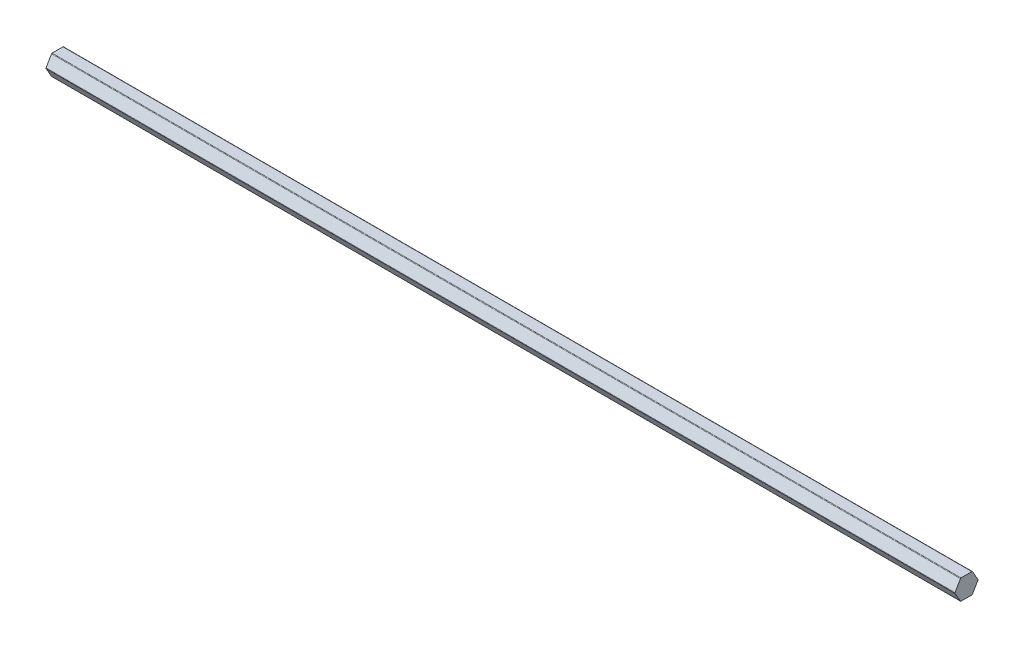
ISO-10303-21;
HEADER;
FILE_DESCRIPTION(('STEP AP214'),'2;1');
FILE_NAME('part.step','',(''),(''),'','','');
FILE_SCHEMA(('AUTOMOTIVE_DESIGN { 1 0 10303 214 1 1 1 1 }'));
ENDSEC;
DATA;
#1=APPLICATION_CONTEXT('core data for automotive mechanical design processes');
#2=APPLICATION_PROTOCOL_DEFINITION('international standard','automotive_design',2000,#1);
#3=PRODUCT_CONTEXT('',#1,'mechanical');
#4=PRODUCT('Part','Part','',(#3));
#5=PRODUCT_RELATED_PRODUCT_CATEGORY('part','',(#4));
#6=PRODUCT_DEFINITION_FORMATION('','',#4);
#7=PRODUCT_DEFINITION_CONTEXT('part definition',#1,'design');
#8=PRODUCT_DEFINITION('design','',#6,#7);
#9=PRODUCT_DEFINITION_SHAPE('','',#8);
#10=(LENGTH_UNIT() NAMED_UNIT(*) SI_UNIT(.MILLI.,.METRE.));
#11=(NAMED_UNIT(*) PLANE_ANGLE_UNIT() SI_UNIT($,.RADIAN.));
#12=(NAMED_UNIT(*) SI_UNIT($,.STERADIAN.) SOLID_ANGLE_UNIT());
#13=UNCERTAINTY_MEASURE_WITH_UNIT(LENGTH_MEASURE(1.E-05),#10,'distance_accuracy_value','');
#14=(GEOMETRIC_REPRESENTATION_CONTEXT(3) GLOBAL_UNCERTAINTY_ASSIGNED_CONTEXT((#13)) GLOBAL_UNIT_ASSIGNED_CONTEXT((#10,
#11,#12)) REPRESENTATION_CONTEXT('',''));
#15=CARTESIAN_POINT('',(0.,0.,0.));
#16=DIRECTION('',(0.,0.,1.));
#17=DIRECTION('',(1.,0.,0.));
#18=AXIS2_PLACEMENT_3D('',#15,#16,#17);
#19=CARTESIAN_POINT('',(285.75,-5.85,3.37749907475931));
#20=DIRECTION('',(-1.,0.,0.));
#21=DIRECTION('',(0.,0.,1.));
#22=AXIS2_PLACEMENT_3D('',#19,#20,#21);
#23=CYLINDRICAL_SURFACE('',#22,0.5);
#24=CARTESIAN_POINT('',(-285.75,-5.85,3.37749907475931));
#25=DIRECTION('',(1.,0.,0.));
#26=DIRECTION('',(0.,0.,-1.));
#27=AXIS2_PLACEMENT_3D('',#24,#25,#26);
#28=CIRCLE('',#27,0.5);
#29=CARTESIAN_POINT('',(-285.75,-6.09999999999999,3.81051177665153));
#30=VERTEX_POINT('',#29);
#31=CARTESIAN_POINT('',(-285.75,-6.35,3.37749907475931));
#32=VERTEX_POINT('',#31);
#33=EDGE_CURVE('E164',#30,#32,#28,.T.);
#34=ORIENTED_EDGE('',*,*,#33,.T.);
#35=DIRECTION('',(-1.,0.,0.));
#36=VECTOR('',#35,1.);
#37=CARTESIAN_POINT('',(285.75,-6.35,3.37749907475931));
#38=LINE('',#37,#36);
#39=CARTESIAN_POINT('',(285.75,-6.35,3.37749907475931));
#40=VERTEX_POINT('',#39);
#41=EDGE_CURVE('E11',#40,#32,#38,.T.);
#42=ORIENTED_EDGE('',*,*,#41,.F.);
#43=CARTESIAN_POINT('',(285.75,-5.85,3.37749907475931));
#44=DIRECTION('',(1.,0.,0.));
#45=DIRECTION('',(0.,0.,-1.));
#46=AXIS2_PLACEMENT_3D('',#43,#44,#45);
#47=CIRCLE('',#46,0.5);
#48=CARTESIAN_POINT('',(285.75,-6.09999999999999,3.81051177665153));
#49=VERTEX_POINT('',#48);
#50=EDGE_CURVE('E198',#49,#40,#47,.T.);
#51=ORIENTED_EDGE('',*,*,#50,.F.);
#52=DIRECTION('',(-1.,0.,0.));
#53=VECTOR('',#52,1.);
#54=CARTESIAN_POINT('',(285.75,-6.09999999999999,3.81051177665153));
#55=LINE('',#54,#53);
#56=EDGE_CURVE('E160',#49,#30,#55,.T.);
#57=ORIENTED_EDGE('',*,*,#56,.T.);
#58=EDGE_LOOP('',(#34,#42,#51,#57));
#59=FACE_BOUND('',#58,.T.);
#60=ADVANCED_FACE('F39',(#59),#23,.T.);
#61=CARTESIAN_POINT('',(285.75,-6.35,3.37749907475931));
#62=DIRECTION('',(0.,1.,0.));
#63=DIRECTION('',(0.,0.,1.));
#64=AXIS2_PLACEMENT_3D('',#61,#62,#63);
#65=PLANE('',#64);
#66=DIRECTION('',(0.,0.,-1.));
#67=VECTOR('',#66,1.);
#68=CARTESIAN_POINT('',(-285.75,-6.35,3.37749907475931));
#69=LINE('',#68,#67);
#70=CARTESIAN_POINT('',(-285.75,-6.35,-3.3774990747593));
#71=VERTEX_POINT('',#70);
#72=EDGE_CURVE('E168',#32,#71,#69,.T.);
#73=ORIENTED_EDGE('',*,*,#72,.T.);
#74=DIRECTION('',(-1.,0.,0.));
#75=VECTOR('',#74,1.);
#76=CARTESIAN_POINT('',(285.75,-6.35,-3.3774990747593));
#77=LINE('',#76,#75);
#78=CARTESIAN_POINT('',(285.75,-6.35,-3.3774990747593));
#79=VERTEX_POINT('',#78);
#80=EDGE_CURVE('E48',#79,#71,#77,.T.);
#81=ORIENTED_EDGE('',*,*,#80,.F.);
#82=DIRECTION('',(0.,0.,-1.));
#83=VECTOR('',#82,1.);
#84=CARTESIAN_POINT('',(285.75,-6.35,3.37749907475931));
#85=LINE('',#84,#83);
#86=EDGE_CURVE('E111',#40,#79,#85,.T.);
#87=ORIENTED_EDGE('',*,*,#86,.F.);
#88=ORIENTED_EDGE('',*,*,#41,.T.);
#89=EDGE_LOOP('',(#73,#81,#87,#88));
#90=FACE_BOUND('',#89,.T.);
#91=ADVANCED_FACE('F292',(#90),#65,.F.);
#92=CARTESIAN_POINT('',(285.75,-5.85,-3.37749907475931));
#93=DIRECTION('',(-1.,0.,0.));
#94=DIRECTION('',(0.,0.,1.));
#95=AXIS2_PLACEMENT_3D('',#92,#93,#94);
#96=CYLINDRICAL_SURFACE('',#95,0.5);
#97=CARTESIAN_POINT('',(-285.75,-5.85,-3.37749907475931));
#98=DIRECTION('',(1.,0.,0.));
#99=DIRECTION('',(0.,0.,-1.));
#100=AXIS2_PLACEMENT_3D('',#97,#98,#99);
#101=CIRCLE('',#100,0.5);
#102=CARTESIAN_POINT('',(-285.75,-6.1,-3.81051177665153));
#103=VERTEX_POINT('',#102);
#104=EDGE_CURVE('E171',#71,#103,#101,.T.);
#105=ORIENTED_EDGE('',*,*,#104,.T.);
#106=DIRECTION('',(-1.,0.,0.));
#107=VECTOR('',#106,1.);
#108=CARTESIAN_POINT('',(285.75,-6.1,-3.81051177665153));
#109=LINE('',#108,#107);
#110=CARTESIAN_POINT('',(285.75,-6.1,-3.81051177665153));
#111=VERTEX_POINT('',#110);
#112=EDGE_CURVE('E225',#111,#103,#109,.T.);
#113=ORIENTED_EDGE('',*,*,#112,.F.);
#114=CARTESIAN_POINT('',(285.75,-5.85,-3.37749907475931));
#115=DIRECTION('',(1.,0.,0.));
#116=DIRECTION('',(0.,0.,-1.));
#117=AXIS2_PLACEMENT_3D('',#114,#115,#116);
#118=CIRCLE('',#117,0.5);
#119=EDGE_CURVE('E235',#79,#111,#118,.T.);
#120=ORIENTED_EDGE('',*,*,#119,.F.);
#121=ORIENTED_EDGE('',*,*,#80,.T.);
#122=EDGE_LOOP('',(#105,#113,#120,#121));
#123=FACE_BOUND('',#122,.T.);
#124=ADVANCED_FACE('F233',(#123),#96,.T.);
#125=CARTESIAN_POINT('',(285.75,-6.1,-3.81051177665153));
#126=DIRECTION('',(0.,0.5,0.866025403784439));
#127=DIRECTION('',(0.,-0.866025403784439,0.5));
#128=AXIS2_PLACEMENT_3D('',#125,#126,#127);
#129=PLANE('',#128);
#130=DIRECTION('',(0.,0.866025403784439,-0.5));
#131=VECTOR('',#130,1.);
#132=CARTESIAN_POINT('',(-285.75,-6.1,-3.81051177665153));
#133=LINE('',#132,#131);
#134=CARTESIAN_POINT('',(-285.75,-0.250000000000002,-7.18801085141083));
#135=VERTEX_POINT('',#134);
#136=EDGE_CURVE('E174',#103,#135,#133,.T.);
#137=ORIENTED_EDGE('',*,*,#136,.T.);
#138=DIRECTION('',(-1.,0.,0.));
#139=VECTOR('',#138,1.);
#140=CARTESIAN_POINT('',(285.75,-0.250000000000002,-7.18801085141083));
#141=LINE('',#140,#139);
#142=CARTESIAN_POINT('',(285.75,-0.250000000000002,-7.18801085141083));
#143=VERTEX_POINT('',#142);
#144=EDGE_CURVE('E221',#143,#135,#141,.T.);
#145=ORIENTED_EDGE('',*,*,#144,.F.);
#146=DIRECTION('',(0.,0.866025403784439,-0.5));
#147=VECTOR('',#146,1.);
#148=CARTESIAN_POINT('',(285.75,-6.1,-3.81051177665153));
#149=LINE('',#148,#147);
#150=EDGE_CURVE('E254',#111,#143,#149,.T.);
#151=ORIENTED_EDGE('',*,*,#150,.F.);
#152=ORIENTED_EDGE('',*,*,#112,.T.);
#153=EDGE_LOOP('',(#137,#145,#151,#152));
#154=FACE_BOUND('',#153,.T.);
#155=ADVANCED_FACE('F244',(#154),#129,.F.);
#156=CARTESIAN_POINT('',(285.75,0.,-6.75499814951862));
#157=DIRECTION('',(-1.,0.,0.));
#158=DIRECTION('',(0.,0.,1.));
#159=AXIS2_PLACEMENT_3D('',#156,#157,#158);
#160=CYLINDRICAL_SURFACE('',#159,0.5);
#161=CARTESIAN_POINT('',(-285.75,0.,-6.75499814951862));
#162=DIRECTION('',(1.,0.,0.));
#163=DIRECTION('',(0.,0.,1.));
#164=AXIS2_PLACEMENT_3D('',#161,#162,#163);
#165=CIRCLE('',#164,0.5);
#166=CARTESIAN_POINT('',(-285.75,0.250000000000002,-7.18801085141083));
#167=VERTEX_POINT('',#166);
#168=EDGE_CURVE('E177',#135,#167,#165,.T.);
#169=ORIENTED_EDGE('',*,*,#168,.T.);
#170=DIRECTION('',(-1.,0.,0.));
#171=VECTOR('',#170,1.);
#172=CARTESIAN_POINT('',(285.75,0.250000000000002,-7.18801085141083));
#173=LINE('',#172,#171);
#174=CARTESIAN_POINT('',(285.75,0.250000000000002,-7.18801085141083));
#175=VERTEX_POINT('',#174);
#176=EDGE_CURVE('E217',#175,#167,#173,.T.);
#177=ORIENTED_EDGE('',*,*,#176,.F.);
#178=CARTESIAN_POINT('',(285.75,0.,-6.75499814951862));
#179=DIRECTION('',(1.,0.,0.));
#180=DIRECTION('',(0.,0.,1.));
#181=AXIS2_PLACEMENT_3D('',#178,#179,#180);
#182=CIRCLE('',#181,0.5);
#183=EDGE_CURVE('E250',#143,#175,#182,.T.);
#184=ORIENTED_EDGE('',*,*,#183,.F.);
#185=ORIENTED_EDGE('',*,*,#144,.T.);
#186=EDGE_LOOP('',(#169,#177,#184,#185));
#187=FACE_BOUND('',#186,.T.);
#188=ADVANCED_FACE('F248',(#187),#160,.T.);
#189=CARTESIAN_POINT('',(285.75,0.250000000000002,-7.18801085141083));
#190=DIRECTION('',(0.,-0.5,0.866025403784439));
#191=DIRECTION('',(0.,-0.866025403784439,-0.5));
#192=AXIS2_PLACEMENT_3D('',#189,#190,#191);
#193=PLANE('',#192);
#194=DIRECTION('',(0.,0.866025403784439,0.5));
#195=VECTOR('',#194,1.);
#196=CARTESIAN_POINT('',(-285.75,0.250000000000002,-7.18801085141083));
#197=LINE('',#196,#195);
#198=CARTESIAN_POINT('',(-285.75,6.1,-3.81051177665153));
#199=VERTEX_POINT('',#198);
#200=EDGE_CURVE('E180',#167,#199,#197,.T.);
#201=ORIENTED_EDGE('',*,*,#200,.T.);
#202=DIRECTION('',(-1.,0.,0.));
#203=VECTOR('',#202,1.);
#204=CARTESIAN_POINT('',(285.75,6.1,-3.81051177665153));
#205=LINE('',#204,#203);
#206=CARTESIAN_POINT('',(285.75,6.1,-3.81051177665153));
#207=VERTEX_POINT('',#206);
#208=EDGE_CURVE('E213',#207,#199,#205,.T.);
#209=ORIENTED_EDGE('',*,*,#208,.F.);
#210=DIRECTION('',(0.,0.866025403784439,0.5));
#211=VECTOR('',#210,1.);
#212=CARTESIAN_POINT('',(285.75,0.250000000000002,-7.18801085141083));
#213=LINE('',#212,#211);
#214=EDGE_CURVE('E253',#175,#207,#213,.T.);
#215=ORIENTED_EDGE('',*,*,#214,.F.);
#216=ORIENTED_EDGE('',*,*,#176,.T.);
#217=EDGE_LOOP('',(#201,#209,#215,#216));
#218=FACE_BOUND('',#217,.T.);
#219=ADVANCED_FACE('F305',(#218),#193,.F.);
#220=CARTESIAN_POINT('',(285.75,5.85,-3.37749907475931));
#221=DIRECTION('',(-1.,0.,0.));
#222=DIRECTION('',(0.,0.,1.));
#223=AXIS2_PLACEMENT_3D('',#220,#221,#222);
#224=CYLINDRICAL_SURFACE('',#223,0.5);
#225=CARTESIAN_POINT('',(-285.75,5.85,-3.37749907475931));
#226=DIRECTION('',(1.,0.,0.));
#227=DIRECTION('',(0.,0.,-1.));
#228=AXIS2_PLACEMENT_3D('',#225,#226,#227);
#229=CIRCLE('',#228,0.5);
#230=CARTESIAN_POINT('',(-285.75,6.35,-3.3774990747593));
#231=VERTEX_POINT('',#230);
#232=EDGE_CURVE('E183',#199,#231,#229,.T.);
#233=ORIENTED_EDGE('',*,*,#232,.T.);
#234=DIRECTION('',(-1.,0.,0.));
#235=VECTOR('',#234,1.);
#236=CARTESIAN_POINT('',(285.75,6.35,-3.3774990747593));
#237=LINE('',#236,#235);
#238=CARTESIAN_POINT('',(285.75,6.35,-3.3774990747593));
#239=VERTEX_POINT('',#238);
#240=EDGE_CURVE('E209',#239,#231,#237,.T.);
#241=ORIENTED_EDGE('',*,*,#240,.F.);
#242=CARTESIAN_POINT('',(285.75,5.85,-3.37749907475931));
#243=DIRECTION('',(1.,0.,0.));
#244=DIRECTION('',(0.,0.,-1.));
#245=AXIS2_PLACEMENT_3D('',#242,#243,#244);
#246=CIRCLE('',#245,0.5);
#247=EDGE_CURVE('E258',#207,#239,#246,.T.);
#248=ORIENTED_EDGE('',*,*,#247,.F.);
#249=ORIENTED_EDGE('',*,*,#208,.T.);
#250=EDGE_LOOP('',(#233,#241,#248,#249));
#251=FACE_BOUND('',#250,.T.);
#252=ADVANCED_FACE('F308',(#251),#224,.T.);
#253=CARTESIAN_POINT('',(285.75,6.35,-3.3774990747593));
#254=DIRECTION('',(0.,-1.,0.));
#255=DIRECTION('',(0.,0.,-1.));
#256=AXIS2_PLACEMENT_3D('',#253,#254,#255);
#257=PLANE('',#256);
#258=DIRECTION('',(0.,0.,1.));
#259=VECTOR('',#258,1.);
#260=CARTESIAN_POINT('',(-285.75,6.35,-3.3774990747593));
#261=LINE('',#260,#259);
#262=CARTESIAN_POINT('',(-285.75,6.35,3.37749907475931));
#263=VERTEX_POINT('',#262);
#264=EDGE_CURVE('E186',#231,#263,#261,.T.);
#265=ORIENTED_EDGE('',*,*,#264,.T.);
#266=DIRECTION('',(-1.,0.,0.));
#267=VECTOR('',#266,1.);
#268=CARTESIAN_POINT('',(285.75,6.35,3.37749907475931));
#269=LINE('',#268,#267);
#270=CARTESIAN_POINT('',(285.75,6.35,3.37749907475931));
#271=VERTEX_POINT('',#270);
#272=EDGE_CURVE('E205',#271,#263,#269,.T.);
#273=ORIENTED_EDGE('',*,*,#272,.F.);
#274=DIRECTION('',(0.,0.,1.));
#275=VECTOR('',#274,1.);
#276=CARTESIAN_POINT('',(285.75,6.35,-3.3774990747593));
#277=LINE('',#276,#275);
#278=EDGE_CURVE('E265',#239,#271,#277,.T.);
#279=ORIENTED_EDGE('',*,*,#278,.F.);
#280=ORIENTED_EDGE('',*,*,#240,.T.);
#281=EDGE_LOOP('',(#265,#273,#279,#280));
#282=FACE_BOUND('',#281,.T.);
#283=ADVANCED_FACE('F273',(#282),#257,.F.);
#284=CARTESIAN_POINT('',(285.75,5.85,3.37749907475931));
#285=DIRECTION('',(-1.,0.,0.));
#286=DIRECTION('',(0.,0.,1.));
#287=AXIS2_PLACEMENT_3D('',#284,#285,#286);
#288=CYLINDRICAL_SURFACE('',#287,0.500000000000001);
#289=CARTESIAN_POINT('',(-285.75,5.85,3.37749907475931));
#290=DIRECTION('',(1.,0.,0.));
#291=DIRECTION('',(0.,0.,-1.));
#292=AXIS2_PLACEMENT_3D('',#289,#290,#291);
#293=CIRCLE('',#292,0.500000000000001);
#294=CARTESIAN_POINT('',(-285.75,6.1,3.81051177665153));
#295=VERTEX_POINT('',#294);
#296=EDGE_CURVE('E189',#263,#295,#293,.T.);
#297=ORIENTED_EDGE('',*,*,#296,.T.);
#298=DIRECTION('',(-1.,0.,0.));
#299=VECTOR('',#298,1.);
#300=CARTESIAN_POINT('',(285.75,6.1,3.81051177665153));
#301=LINE('',#300,#299);
#302=CARTESIAN_POINT('',(285.75,6.1,3.81051177665153));
#303=VERTEX_POINT('',#302);
#304=EDGE_CURVE('E153',#303,#295,#301,.T.);
#305=ORIENTED_EDGE('',*,*,#304,.F.);
#306=CARTESIAN_POINT('',(285.75,5.85,3.37749907475931));
#307=DIRECTION('',(1.,0.,0.));
#308=DIRECTION('',(0.,0.,-1.));
#309=AXIS2_PLACEMENT_3D('',#306,#307,#308);
#310=CIRCLE('',#309,0.500000000000001);
#311=EDGE_CURVE('E142',#271,#303,#310,.T.);
#312=ORIENTED_EDGE('',*,*,#311,.F.);
#313=ORIENTED_EDGE('',*,*,#272,.T.);
#314=EDGE_LOOP('',(#297,#305,#312,#313));
#315=FACE_BOUND('',#314,.T.);
#316=ADVANCED_FACE('F277',(#315),#288,.T.);
#317=CARTESIAN_POINT('',(285.75,6.1,3.81051177665153));
#318=DIRECTION('',(0.,-0.5,-0.866025403784439));
#319=DIRECTION('',(0.,0.866025403784439,-0.5));
#320=AXIS2_PLACEMENT_3D('',#317,#318,#319);
#321=PLANE('',#320);
#322=DIRECTION('',(0.,-0.866025403784439,0.5));
#323=VECTOR('',#322,1.);
#324=CARTESIAN_POINT('',(-285.75,6.1,3.81051177665153));
#325=LINE('',#324,#323);
#326=CARTESIAN_POINT('',(-285.75,0.250000000000004,7.18801085141084));
#327=VERTEX_POINT('',#326);
#328=EDGE_CURVE('E151',#295,#327,#325,.T.);
#329=ORIENTED_EDGE('',*,*,#328,.T.);
#330=DIRECTION('',(-1.,0.,0.));
#331=VECTOR('',#330,1.);
#332=CARTESIAN_POINT('',(285.75,0.250000000000004,7.18801085141084));
#333=LINE('',#332,#331);
#334=CARTESIAN_POINT('',(285.75,0.250000000000004,7.18801085141084));
#335=VERTEX_POINT('',#334);
#336=EDGE_CURVE('E148',#335,#327,#333,.T.);
#337=ORIENTED_EDGE('',*,*,#336,.F.);
#338=DIRECTION('',(0.,-0.866025403784439,0.5));
#339=VECTOR('',#338,1.);
#340=CARTESIAN_POINT('',(285.75,6.1,3.81051177665153));
#341=LINE('',#340,#339);
#342=EDGE_CURVE('E136',#303,#335,#341,.T.);
#343=ORIENTED_EDGE('',*,*,#342,.F.);
#344=ORIENTED_EDGE('',*,*,#304,.T.);
#345=EDGE_LOOP('',(#329,#337,#343,#344));
#346=FACE_BOUND('',#345,.T.);
#347=ADVANCED_FACE('F149',(#346),#321,.F.);
#348=CARTESIAN_POINT('',(285.75,0.,6.75499814951862));
#349=DIRECTION('',(-1.,0.,0.));
#350=DIRECTION('',(0.,0.,1.));
#351=AXIS2_PLACEMENT_3D('',#348,#349,#350);
#352=CYLINDRICAL_SURFACE('',#351,0.5);
#353=CARTESIAN_POINT('',(-285.75,0.,6.75499814951862));
#354=DIRECTION('',(1.,0.,0.));
#355=DIRECTION('',(0.,0.,-1.));
#356=AXIS2_PLACEMENT_3D('',#353,#354,#355);
#357=CIRCLE('',#356,0.5);
#358=CARTESIAN_POINT('',(-285.75,-0.25,7.18801085141084));
#359=VERTEX_POINT('',#358);
#360=EDGE_CURVE('E97',#327,#359,#357,.T.);
#361=ORIENTED_EDGE('',*,*,#360,.T.);
#362=DIRECTION('',(-1.,0.,0.));
#363=VECTOR('',#362,1.);
#364=CARTESIAN_POINT('',(285.75,-0.25,7.18801085141084));
#365=LINE('',#364,#363);
#366=CARTESIAN_POINT('',(285.75,-0.25,7.18801085141084));
#367=VERTEX_POINT('',#366);
#368=EDGE_CURVE('E154',#367,#359,#365,.T.);
#369=ORIENTED_EDGE('',*,*,#368,.F.);
#370=CARTESIAN_POINT('',(285.75,0.,6.75499814951862));
#371=DIRECTION('',(1.,0.,0.));
#372=DIRECTION('',(0.,0.,-1.));
#373=AXIS2_PLACEMENT_3D('',#370,#371,#372);
#374=CIRCLE('',#373,0.5);
#375=EDGE_CURVE('E140',#335,#367,#374,.T.);
#376=ORIENTED_EDGE('',*,*,#375,.F.);
#377=ORIENTED_EDGE('',*,*,#336,.T.);
#378=EDGE_LOOP('',(#361,#369,#376,#377));
#379=FACE_BOUND('',#378,.T.);
#380=ADVANCED_FACE('F156',(#379),#352,.T.);
#381=CARTESIAN_POINT('',(285.75,-0.25,7.18801085141084));
#382=DIRECTION('',(0.,0.5,-0.866025403784439));
#383=DIRECTION('',(0.,0.866025403784439,0.5));
#384=AXIS2_PLACEMENT_3D('',#381,#382,#383);
#385=PLANE('',#384);
#386=DIRECTION('',(0.,-0.866025403784439,-0.5));
#387=VECTOR('',#386,1.);
#388=CARTESIAN_POINT('',(-285.75,-0.25,7.18801085141084));
#389=LINE('',#388,#387);
#390=EDGE_CURVE('E103',#359,#30,#389,.T.);
#391=ORIENTED_EDGE('',*,*,#390,.T.);
#392=ORIENTED_EDGE('',*,*,#56,.F.);
#393=DIRECTION('',(0.,-0.866025403784439,-0.5));
#394=VECTOR('',#393,1.);
#395=CARTESIAN_POINT('',(285.75,-0.25,7.18801085141084));
#396=LINE('',#395,#394);
#397=EDGE_CURVE('E56',#367,#49,#396,.T.);
#398=ORIENTED_EDGE('',*,*,#397,.F.);
#399=ORIENTED_EDGE('',*,*,#368,.T.);
#400=EDGE_LOOP('',(#391,#392,#398,#399));
#401=FACE_BOUND('',#400,.T.);
#402=ADVANCED_FACE('F281',(#401),#385,.F.);
#403=CARTESIAN_POINT('',(285.75,-5.85,3.37749907475931));
#404=DIRECTION('',(1.,0.,0.));
#405=DIRECTION('',(0.,0.,-1.));
#406=AXIS2_PLACEMENT_3D('',#403,#404,#405);
#407=PLANE('',#406);
#408=ORIENTED_EDGE('',*,*,#50,.T.);
#409=ORIENTED_EDGE('',*,*,#86,.T.);
#410=ORIENTED_EDGE('',*,*,#119,.T.);
#411=ORIENTED_EDGE('',*,*,#150,.T.);
#412=ORIENTED_EDGE('',*,*,#183,.T.);
#413=ORIENTED_EDGE('',*,*,#214,.T.);
#414=ORIENTED_EDGE('',*,*,#247,.T.);
#415=ORIENTED_EDGE('',*,*,#278,.T.);
#416=ORIENTED_EDGE('',*,*,#311,.T.);
#417=ORIENTED_EDGE('',*,*,#342,.T.);
#418=ORIENTED_EDGE('',*,*,#375,.T.);
#419=ORIENTED_EDGE('',*,*,#397,.T.);
#420=EDGE_LOOP('',(#408,#409,#410,#411,#412,#413,#414,#415,#416,#417,#418,#419));
#421=FACE_BOUND('',#420,.T.);
#422=ADVANCED_FACE('F138',(#421),#407,.T.);
#423=CARTESIAN_POINT('',(-285.75,-5.85,3.37749907475931));
#424=DIRECTION('',(1.,0.,0.));
#425=DIRECTION('',(0.,0.,-1.));
#426=AXIS2_PLACEMENT_3D('',#423,#424,#425);
#427=PLANE('',#426);
#428=ORIENTED_EDGE('',*,*,#33,.F.);
#429=ORIENTED_EDGE('',*,*,#390,.F.);
#430=ORIENTED_EDGE('',*,*,#360,.F.);
#431=ORIENTED_EDGE('',*,*,#328,.F.);
#432=ORIENTED_EDGE('',*,*,#296,.F.);
#433=ORIENTED_EDGE('',*,*,#264,.F.);
#434=ORIENTED_EDGE('',*,*,#232,.F.);
#435=ORIENTED_EDGE('',*,*,#200,.F.);
#436=ORIENTED_EDGE('',*,*,#168,.F.);
#437=ORIENTED_EDGE('',*,*,#136,.F.);
#438=ORIENTED_EDGE('',*,*,#104,.F.);
#439=ORIENTED_EDGE('',*,*,#72,.F.);
#440=EDGE_LOOP('',(#428,#429,#430,#431,#432,#433,#434,#435,#436,#437,#438,#439));
#441=FACE_BOUND('',#440,.T.);
#442=ADVANCED_FACE('F239',(#441),#427,.F.);
#443=CLOSED_SHELL('',(#60,#91,#124,#155,#188,#219,#252,#283,#316,#347,#380,#402,#422,#442));
#444=MANIFOLD_SOLID_BREP('B2',#443);
#445=ADVANCED_BREP_SHAPE_REPRESENTATION('',(#18,#444),#14);
#446=SHAPE_DEFINITION_REPRESENTATION(#9,#445);
ENDSEC;
END-ISO-10303-21;
